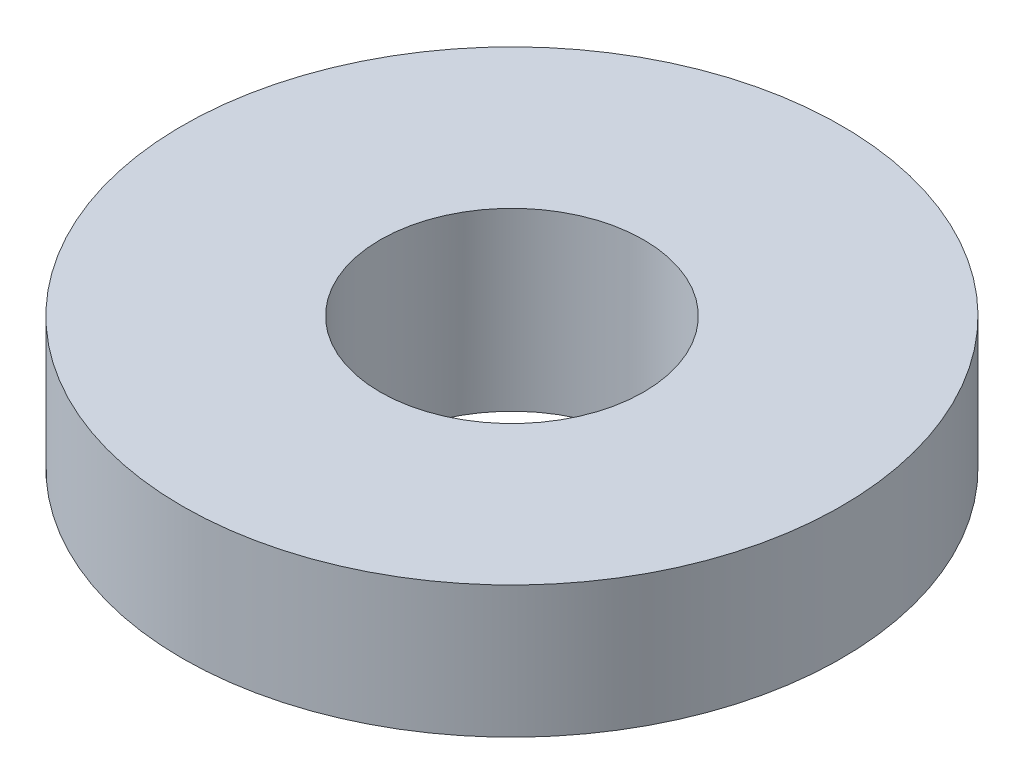
ISO-10303-21;
HEADER;
FILE_DESCRIPTION(('STEP AP214'),'2;1');
FILE_NAME('part.step','',(''),(''),'','','');
FILE_SCHEMA(('AUTOMOTIVE_DESIGN { 1 0 10303 214 1 1 1 1 }'));
ENDSEC;
DATA;
#1=APPLICATION_CONTEXT('core data for automotive mechanical design processes');
#2=APPLICATION_PROTOCOL_DEFINITION('international standard','automotive_design',2000,#1);
#3=PRODUCT_CONTEXT('',#1,'mechanical');
#4=PRODUCT('Part','Part','',(#3));
#5=PRODUCT_RELATED_PRODUCT_CATEGORY('part','',(#4));
#6=PRODUCT_DEFINITION_FORMATION('','',#4);
#7=PRODUCT_DEFINITION_CONTEXT('part definition',#1,'design');
#8=PRODUCT_DEFINITION('design','',#6,#7);
#9=PRODUCT_DEFINITION_SHAPE('','',#8);
#10=(LENGTH_UNIT() NAMED_UNIT(*) SI_UNIT(.MILLI.,.METRE.));
#11=(NAMED_UNIT(*) PLANE_ANGLE_UNIT() SI_UNIT($,.RADIAN.));
#12=(NAMED_UNIT(*) SI_UNIT($,.STERADIAN.) SOLID_ANGLE_UNIT());
#13=UNCERTAINTY_MEASURE_WITH_UNIT(LENGTH_MEASURE(1.E-05),#10,'distance_accuracy_value','');
#14=(GEOMETRIC_REPRESENTATION_CONTEXT(3) GLOBAL_UNCERTAINTY_ASSIGNED_CONTEXT((#13)) GLOBAL_UNIT_ASSIGNED_CONTEXT((#10,
#11,#12)) REPRESENTATION_CONTEXT('',''));
#15=CARTESIAN_POINT('',(0.,0.,0.));
#16=DIRECTION('',(0.,0.,1.));
#17=DIRECTION('',(1.,0.,0.));
#18=AXIS2_PLACEMENT_3D('',#15,#16,#17);
#19=CARTESIAN_POINT('',(0.,1.5,0.));
#20=DIRECTION('',(0.,-1.,0.));
#21=DIRECTION('',(0.,0.,-1.));
#22=AXIS2_PLACEMENT_3D('',#19,#20,#21);
#23=CYLINDRICAL_SURFACE('',#22,3.75);
#24=CARTESIAN_POINT('',(0.,1.5,0.));
#25=DIRECTION('',(0.,1.,0.));
#26=DIRECTION('',(0.,0.,1.));
#27=AXIS2_PLACEMENT_3D('',#24,#25,#26);
#28=CIRCLE('',#27,3.75);
#29=CARTESIAN_POINT('',(0.,1.5,3.75));
#30=VERTEX_POINT('',#29);
#31=EDGE_CURVE('E52',#30,#30,#28,.T.);
#32=ORIENTED_EDGE('',*,*,#31,.F.);
#33=EDGE_LOOP('',(#32));
#34=FACE_BOUND('',#33,.T.);
#35=CARTESIAN_POINT('',(0.,0.,0.));
#36=DIRECTION('',(0.,1.,0.));
#37=DIRECTION('',(0.,0.,1.));
#38=AXIS2_PLACEMENT_3D('',#35,#36,#37);
#39=CIRCLE('',#38,3.75);
#40=CARTESIAN_POINT('',(0.,0.,3.75));
#41=VERTEX_POINT('',#40);
#42=EDGE_CURVE('E48',#41,#41,#39,.T.);
#43=ORIENTED_EDGE('',*,*,#42,.T.);
#44=EDGE_LOOP('',(#43));
#45=FACE_BOUND('',#44,.T.);
#46=ADVANCED_FACE('F45',(#34,#45),#23,.T.);
#47=CARTESIAN_POINT('',(0.,1.5,0.));
#48=DIRECTION('',(0.,1.,0.));
#49=DIRECTION('',(0.,0.,1.));
#50=AXIS2_PLACEMENT_3D('',#47,#48,#49);
#51=PLANE('',#50);
#52=CARTESIAN_POINT('',(0.,1.5,0.));
#53=DIRECTION('',(0.,1.,0.));
#54=DIRECTION('',(0.,0.,1.));
#55=AXIS2_PLACEMENT_3D('',#52,#53,#54);
#56=CIRCLE('',#55,1.5);
#57=CARTESIAN_POINT('',(0.,1.5,1.5));
#58=VERTEX_POINT('',#57);
#59=EDGE_CURVE('E61',#58,#58,#56,.F.);
#60=ORIENTED_EDGE('',*,*,#59,.T.);
#61=EDGE_LOOP('',(#60));
#62=FACE_BOUND('',#61,.T.);
#63=ORIENTED_EDGE('',*,*,#31,.T.);
#64=EDGE_LOOP('',(#63));
#65=FACE_BOUND('',#64,.T.);
#66=ADVANCED_FACE('F84',(#62,#65),#51,.T.);
#67=CARTESIAN_POINT('',(0.,0.,0.));
#68=DIRECTION('',(0.,1.,0.));
#69=DIRECTION('',(0.,0.,1.));
#70=AXIS2_PLACEMENT_3D('',#67,#68,#69);
#71=PLANE('',#70);
#72=CARTESIAN_POINT('',(0.,0.,0.));
#73=DIRECTION('',(0.,-1.,0.));
#74=DIRECTION('',(0.,0.,-1.));
#75=AXIS2_PLACEMENT_3D('',#72,#73,#74);
#76=CIRCLE('',#75,2.5);
#77=CARTESIAN_POINT('',(0.,0.,-2.5));
#78=VERTEX_POINT('',#77);
#79=EDGE_CURVE('E10',#78,#78,#76,.T.);
#80=ORIENTED_EDGE('',*,*,#79,.F.);
#81=EDGE_LOOP('',(#80));
#82=FACE_BOUND('',#81,.T.);
#83=ORIENTED_EDGE('',*,*,#42,.F.);
#84=EDGE_LOOP('',(#83));
#85=FACE_BOUND('',#84,.T.);
#86=ADVANCED_FACE('F79',(#82,#85),#71,.F.);
#87=CARTESIAN_POINT('',(0.,-0.5,0.));
#88=DIRECTION('',(0.,1.,0.));
#89=DIRECTION('',(0.,0.,1.));
#90=AXIS2_PLACEMENT_3D('',#87,#88,#89);
#91=CYLINDRICAL_SURFACE('',#90,2.5);
#92=CARTESIAN_POINT('',(0.,-0.5,0.));
#93=DIRECTION('',(0.,-1.,0.));
#94=DIRECTION('',(0.,0.,-1.));
#95=AXIS2_PLACEMENT_3D('',#92,#93,#94);
#96=CIRCLE('',#95,2.5);
#97=CARTESIAN_POINT('',(0.,-0.5,-2.5));
#98=VERTEX_POINT('',#97);
#99=EDGE_CURVE('E58',#98,#98,#96,.T.);
#100=ORIENTED_EDGE('',*,*,#99,.F.);
#101=EDGE_LOOP('',(#100));
#102=FACE_BOUND('',#101,.T.);
#103=ORIENTED_EDGE('',*,*,#79,.T.);
#104=EDGE_LOOP('',(#103));
#105=FACE_BOUND('',#104,.T.);
#106=ADVANCED_FACE('F74',(#102,#105),#91,.T.);
#107=CARTESIAN_POINT('',(0.,-0.5,0.));
#108=DIRECTION('',(0.,-1.,0.));
#109=DIRECTION('',(0.,0.,-1.));
#110=AXIS2_PLACEMENT_3D('',#107,#108,#109);
#111=PLANE('',#110);
#112=CARTESIAN_POINT('',(0.,-0.5,0.));
#113=DIRECTION('',(0.,-1.,0.));
#114=DIRECTION('',(0.,0.,-1.));
#115=AXIS2_PLACEMENT_3D('',#112,#113,#114);
#116=CIRCLE('',#115,1.5);
#117=CARTESIAN_POINT('',(0.,-0.5,-1.5));
#118=VERTEX_POINT('',#117);
#119=EDGE_CURVE('E64',#118,#118,#116,.T.);
#120=ORIENTED_EDGE('',*,*,#119,.F.);
#121=EDGE_LOOP('',(#120));
#122=FACE_BOUND('',#121,.T.);
#123=ORIENTED_EDGE('',*,*,#99,.T.);
#124=EDGE_LOOP('',(#123));
#125=FACE_BOUND('',#124,.T.);
#126=ADVANCED_FACE('F71',(#122,#125),#111,.T.);
#127=CARTESIAN_POINT('',(0.,5.74264068711929,0.));
#128=DIRECTION('',(0.,-1.,0.));
#129=DIRECTION('',(0.,0.,-1.));
#130=AXIS2_PLACEMENT_3D('',#127,#128,#129);
#131=CYLINDRICAL_SURFACE('',#130,1.5);
#132=ORIENTED_EDGE('',*,*,#119,.T.);
#133=EDGE_LOOP('',(#132));
#134=FACE_BOUND('',#133,.T.);
#135=ORIENTED_EDGE('',*,*,#59,.F.);
#136=EDGE_LOOP('',(#135));
#137=FACE_BOUND('',#136,.T.);
#138=ADVANCED_FACE('F68',(#134,#137),#131,.F.);
#139=CLOSED_SHELL('',(#46,#66,#86,#106,#126,#138));
#140=MANIFOLD_SOLID_BREP('B2',#139);
#141=ADVANCED_BREP_SHAPE_REPRESENTATION('',(#18,#140),#14);
#142=SHAPE_DEFINITION_REPRESENTATION(#9,#141);
ENDSEC;
END-ISO-10303-21;
